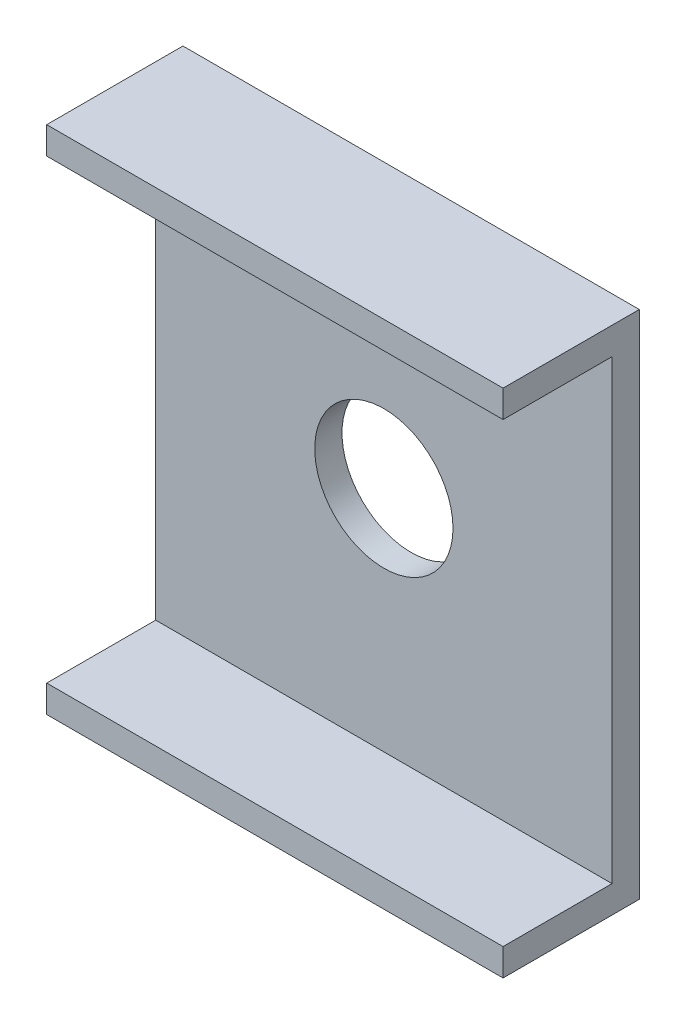
ISO-10303-21;
HEADER;
FILE_DESCRIPTION(('STEP AP214'),'2;1');
FILE_NAME('part.step','',(''),(''),'','','');
FILE_SCHEMA(('AUTOMOTIVE_DESIGN { 1 0 10303 214 1 1 1 1 }'));
ENDSEC;
DATA;
#1=APPLICATION_CONTEXT('core data for automotive mechanical design processes');
#2=APPLICATION_PROTOCOL_DEFINITION('international standard','automotive_design',2000,#1);
#3=PRODUCT_CONTEXT('',#1,'mechanical');
#4=PRODUCT('Part','Part','',(#3));
#5=PRODUCT_RELATED_PRODUCT_CATEGORY('part','',(#4));
#6=PRODUCT_DEFINITION_FORMATION('','',#4);
#7=PRODUCT_DEFINITION_CONTEXT('part definition',#1,'design');
#8=PRODUCT_DEFINITION('design','',#6,#7);
#9=PRODUCT_DEFINITION_SHAPE('','',#8);
#10=(LENGTH_UNIT() NAMED_UNIT(*) SI_UNIT(.MILLI.,.METRE.));
#11=(NAMED_UNIT(*) PLANE_ANGLE_UNIT() SI_UNIT($,.RADIAN.));
#12=(NAMED_UNIT(*) SI_UNIT($,.STERADIAN.) SOLID_ANGLE_UNIT());
#13=UNCERTAINTY_MEASURE_WITH_UNIT(LENGTH_MEASURE(1.E-05),#10,'distance_accuracy_value','');
#14=(GEOMETRIC_REPRESENTATION_CONTEXT(3) GLOBAL_UNCERTAINTY_ASSIGNED_CONTEXT((#13)) GLOBAL_UNIT_ASSIGNED_CONTEXT((#10,
#11,#12)) REPRESENTATION_CONTEXT('',''));
#15=CARTESIAN_POINT('',(0.,0.,0.));
#16=DIRECTION('',(0.,0.,1.));
#17=DIRECTION('',(1.,0.,0.));
#18=AXIS2_PLACEMENT_3D('',#15,#16,#17);
#19=CARTESIAN_POINT('',(17.018,-19.05,10.16));
#20=DIRECTION('',(0.,0.,-1.));
#21=DIRECTION('',(-1.,0.,0.));
#22=AXIS2_PLACEMENT_3D('',#19,#20,#21);
#23=PLANE('',#22);
#24=DIRECTION('',(1.,0.,0.));
#25=VECTOR('',#24,1.);
#26=CARTESIAN_POINT('',(0.,-19.05,10.16));
#27=LINE('',#26,#25);
#28=CARTESIAN_POINT('',(-17.018,-19.05,10.16));
#29=VERTEX_POINT('',#28);
#30=CARTESIAN_POINT('',(17.018,-19.05,10.16));
#31=VERTEX_POINT('',#30);
#32=EDGE_CURVE('E77',#29,#31,#27,.T.);
#33=ORIENTED_EDGE('',*,*,#32,.T.);
#34=DIRECTION('',(0.,1.,0.));
#35=VECTOR('',#34,1.);
#36=CARTESIAN_POINT('',(17.018,0.,10.16));
#37=LINE('',#36,#35);
#38=CARTESIAN_POINT('',(17.018,-17.018000003175,10.16));
#39=VERTEX_POINT('',#38);
#40=EDGE_CURVE('E115',#31,#39,#37,.T.);
#41=ORIENTED_EDGE('',*,*,#40,.T.);
#42=DIRECTION('',(-1.,0.,0.));
#43=VECTOR('',#42,1.);
#44=CARTESIAN_POINT('',(0.,-17.018,10.16));
#45=LINE('',#44,#43);
#46=CARTESIAN_POINT('',(-17.018,-17.018000003175,10.16));
#47=VERTEX_POINT('',#46);
#48=EDGE_CURVE('E131',#39,#47,#45,.T.);
#49=ORIENTED_EDGE('',*,*,#48,.T.);
#50=DIRECTION('',(0.,-1.,0.));
#51=VECTOR('',#50,1.);
#52=CARTESIAN_POINT('',(-17.018,0.,10.16));
#53=LINE('',#52,#51);
#54=EDGE_CURVE('E101',#47,#29,#53,.T.);
#55=ORIENTED_EDGE('',*,*,#54,.T.);
#56=EDGE_LOOP('',(#33,#41,#49,#55));
#57=FACE_BOUND('',#56,.T.);
#58=ADVANCED_FACE('F16',(#57),#23,.F.);
#59=CARTESIAN_POINT('',(-17.018,17.018,10.16));
#60=DIRECTION('',(0.,0.,1.));
#61=DIRECTION('',(1.,0.,0.));
#62=AXIS2_PLACEMENT_3D('',#59,#60,#61);
#63=PLANE('',#62);
#64=DIRECTION('',(0.,1.,0.));
#65=VECTOR('',#64,1.);
#66=CARTESIAN_POINT('',(17.018,0.,10.16));
#67=LINE('',#66,#65);
#68=CARTESIAN_POINT('',(17.018,17.018000003175,10.16));
#69=VERTEX_POINT('',#68);
#70=CARTESIAN_POINT('',(17.018,19.05,10.16));
#71=VERTEX_POINT('',#70);
#72=EDGE_CURVE('E88',#69,#71,#67,.T.);
#73=ORIENTED_EDGE('',*,*,#72,.T.);
#74=DIRECTION('',(-1.,0.,0.));
#75=VECTOR('',#74,1.);
#76=CARTESIAN_POINT('',(0.,19.05,10.16));
#77=LINE('',#76,#75);
#78=CARTESIAN_POINT('',(-17.018,19.05,10.16));
#79=VERTEX_POINT('',#78);
#80=EDGE_CURVE('E82',#71,#79,#77,.T.);
#81=ORIENTED_EDGE('',*,*,#80,.T.);
#82=DIRECTION('',(0.,-1.,0.));
#83=VECTOR('',#82,1.);
#84=CARTESIAN_POINT('',(-17.018,0.,10.16));
#85=LINE('',#84,#83);
#86=CARTESIAN_POINT('',(-17.018,17.01800000635,10.16));
#87=VERTEX_POINT('',#86);
#88=EDGE_CURVE('E86',#79,#87,#85,.T.);
#89=ORIENTED_EDGE('',*,*,#88,.T.);
#90=DIRECTION('',(1.,0.,0.));
#91=VECTOR('',#90,1.);
#92=CARTESIAN_POINT('',(0.,17.018,10.16));
#93=LINE('',#92,#91);
#94=EDGE_CURVE('E151',#87,#69,#93,.T.);
#95=ORIENTED_EDGE('',*,*,#94,.T.);
#96=EDGE_LOOP('',(#73,#81,#89,#95));
#97=FACE_BOUND('',#96,.T.);
#98=ADVANCED_FACE('F84',(#97),#63,.T.);
#99=CARTESIAN_POINT('',(-17.018,-19.05,0.));
#100=DIRECTION('',(0.,1.,0.));
#101=DIRECTION('',(0.,0.,1.));
#102=AXIS2_PLACEMENT_3D('',#99,#100,#101);
#103=PLANE('',#102);
#104=DIRECTION('',(0.,0.,1.));
#105=VECTOR('',#104,1.);
#106=CARTESIAN_POINT('',(17.018,-19.05,5.08));
#107=LINE('',#106,#105);
#108=CARTESIAN_POINT('',(17.018,-19.05,0.));
#109=VERTEX_POINT('',#108);
#110=EDGE_CURVE('E120',#109,#31,#107,.T.);
#111=ORIENTED_EDGE('',*,*,#110,.T.);
#112=ORIENTED_EDGE('',*,*,#32,.F.);
#113=DIRECTION('',(0.,0.,-1.));
#114=VECTOR('',#113,1.);
#115=CARTESIAN_POINT('',(-17.018,-19.05,5.08));
#116=LINE('',#115,#114);
#117=CARTESIAN_POINT('',(-17.018,-19.05,0.));
#118=VERTEX_POINT('',#117);
#119=EDGE_CURVE('E136',#29,#118,#116,.T.);
#120=ORIENTED_EDGE('',*,*,#119,.T.);
#121=DIRECTION('',(1.,0.,0.));
#122=VECTOR('',#121,1.);
#123=CARTESIAN_POINT('',(0.,-19.05,0.));
#124=LINE('',#123,#122);
#125=EDGE_CURVE('E127',#118,#109,#124,.T.);
#126=ORIENTED_EDGE('',*,*,#125,.T.);
#127=EDGE_LOOP('',(#111,#112,#120,#126));
#128=FACE_BOUND('',#127,.T.);
#129=ADVANCED_FACE('F126',(#128),#103,.F.);
#130=CARTESIAN_POINT('',(-17.018,19.05,0.));
#131=DIRECTION('',(0.,-1.,0.));
#132=DIRECTION('',(1.,0.,0.));
#133=AXIS2_PLACEMENT_3D('',#130,#131,#132);
#134=PLANE('',#133);
#135=DIRECTION('',(0.,0.,1.));
#136=VECTOR('',#135,1.);
#137=CARTESIAN_POINT('',(-17.018,19.05,5.08));
#138=LINE('',#137,#136);
#139=CARTESIAN_POINT('',(-17.018,19.05,0.));
#140=VERTEX_POINT('',#139);
#141=EDGE_CURVE('E92',#140,#79,#138,.T.);
#142=ORIENTED_EDGE('',*,*,#141,.T.);
#143=ORIENTED_EDGE('',*,*,#80,.F.);
#144=DIRECTION('',(0.,0.,-1.));
#145=VECTOR('',#144,1.);
#146=CARTESIAN_POINT('',(17.018,19.05,5.08));
#147=LINE('',#146,#145);
#148=CARTESIAN_POINT('',(17.018,19.05,0.));
#149=VERTEX_POINT('',#148);
#150=EDGE_CURVE('E154',#71,#149,#147,.T.);
#151=ORIENTED_EDGE('',*,*,#150,.T.);
#152=DIRECTION('',(-1.,0.,0.));
#153=VECTOR('',#152,1.);
#154=CARTESIAN_POINT('',(0.,19.05,0.));
#155=LINE('',#154,#153);
#156=EDGE_CURVE('E106',#149,#140,#155,.T.);
#157=ORIENTED_EDGE('',*,*,#156,.T.);
#158=EDGE_LOOP('',(#142,#143,#151,#157));
#159=FACE_BOUND('',#158,.T.);
#160=ADVANCED_FACE('F104',(#159),#134,.F.);
#161=CARTESIAN_POINT('',(-17.018,-19.05,0.));
#162=DIRECTION('',(1.,0.,0.));
#163=DIRECTION('',(0.,1.,0.));
#164=AXIS2_PLACEMENT_3D('',#161,#162,#163);
#165=PLANE('',#164);
#166=ORIENTED_EDGE('',*,*,#119,.F.);
#167=ORIENTED_EDGE('',*,*,#54,.F.);
#168=DIRECTION('',(0.,0.,-1.));
#169=VECTOR('',#168,1.);
#170=CARTESIAN_POINT('',(-17.018,-17.018,6.096));
#171=LINE('',#170,#169);
#172=CARTESIAN_POINT('',(-17.018,-17.01800000635,2.032));
#173=VERTEX_POINT('',#172);
#174=EDGE_CURVE('E128',#47,#173,#171,.T.);
#175=ORIENTED_EDGE('',*,*,#174,.T.);
#176=DIRECTION('',(0.,-1.,0.));
#177=VECTOR('',#176,1.);
#178=CARTESIAN_POINT('',(-17.018,0.,2.032));
#179=LINE('',#178,#177);
#180=CARTESIAN_POINT('',(-17.018,17.01800000635,2.032));
#181=VERTEX_POINT('',#180);
#182=EDGE_CURVE('E139',#181,#173,#179,.T.);
#183=ORIENTED_EDGE('',*,*,#182,.F.);
#184=DIRECTION('',(0.,0.,1.));
#185=VECTOR('',#184,1.);
#186=CARTESIAN_POINT('',(-17.018,17.018,6.096));
#187=LINE('',#186,#185);
#188=EDGE_CURVE('E100',#181,#87,#187,.T.);
#189=ORIENTED_EDGE('',*,*,#188,.T.);
#190=ORIENTED_EDGE('',*,*,#88,.F.);
#191=ORIENTED_EDGE('',*,*,#141,.F.);
#192=DIRECTION('',(0.,-1.,0.));
#193=VECTOR('',#192,1.);
#194=CARTESIAN_POINT('',(-17.018,0.,0.));
#195=LINE('',#194,#193);
#196=EDGE_CURVE('E137',#140,#118,#195,.T.);
#197=ORIENTED_EDGE('',*,*,#196,.T.);
#198=EDGE_LOOP('',(#166,#167,#175,#183,#189,#190,#191,#197));
#199=FACE_BOUND('',#198,.T.);
#200=ADVANCED_FACE('F96',(#199),#165,.F.);
#201=CARTESIAN_POINT('',(-17.018,-17.018,10.16));
#202=DIRECTION('',(0.,-1.,0.));
#203=DIRECTION('',(0.,0.,-1.));
#204=AXIS2_PLACEMENT_3D('',#201,#202,#203);
#205=PLANE('',#204);
#206=ORIENTED_EDGE('',*,*,#174,.F.);
#207=ORIENTED_EDGE('',*,*,#48,.F.);
#208=DIRECTION('',(0.,0.,-1.));
#209=VECTOR('',#208,1.);
#210=CARTESIAN_POINT('',(17.018,-17.0180000127,5.08));
#211=LINE('',#210,#209);
#212=CARTESIAN_POINT('',(17.018,-17.018000003175,2.032));
#213=VERTEX_POINT('',#212);
#214=EDGE_CURVE('E123',#39,#213,#211,.T.);
#215=ORIENTED_EDGE('',*,*,#214,.T.);
#216=DIRECTION('',(1.,0.,0.));
#217=VECTOR('',#216,1.);
#218=CARTESIAN_POINT('',(0.,-17.018,2.032));
#219=LINE('',#218,#217);
#220=EDGE_CURVE('E141',#173,#213,#219,.T.);
#221=ORIENTED_EDGE('',*,*,#220,.F.);
#222=EDGE_LOOP('',(#206,#207,#215,#221));
#223=FACE_BOUND('',#222,.T.);
#224=ADVANCED_FACE('F159',(#223),#205,.F.);
#225=CARTESIAN_POINT('',(17.018,-19.05,0.));
#226=DIRECTION('',(-1.,0.,0.));
#227=DIRECTION('',(0.,0.,1.));
#228=AXIS2_PLACEMENT_3D('',#225,#226,#227);
#229=PLANE('',#228);
#230=ORIENTED_EDGE('',*,*,#150,.F.);
#231=ORIENTED_EDGE('',*,*,#72,.F.);
#232=DIRECTION('',(0.,0.,-1.));
#233=VECTOR('',#232,1.);
#234=CARTESIAN_POINT('',(17.018,17.018,6.096));
#235=LINE('',#234,#233);
#236=CARTESIAN_POINT('',(17.018,17.01800000635,2.032));
#237=VERTEX_POINT('',#236);
#238=EDGE_CURVE('E149',#69,#237,#235,.T.);
#239=ORIENTED_EDGE('',*,*,#238,.T.);
#240=DIRECTION('',(0.,1.,0.));
#241=VECTOR('',#240,1.);
#242=CARTESIAN_POINT('',(17.018,0.,2.032));
#243=LINE('',#242,#241);
#244=EDGE_CURVE('E33',#213,#237,#243,.T.);
#245=ORIENTED_EDGE('',*,*,#244,.F.);
#246=ORIENTED_EDGE('',*,*,#214,.F.);
#247=ORIENTED_EDGE('',*,*,#40,.F.);
#248=ORIENTED_EDGE('',*,*,#110,.F.);
#249=DIRECTION('',(0.,1.,0.));
#250=VECTOR('',#249,1.);
#251=CARTESIAN_POINT('',(17.018,0.,0.));
#252=LINE('',#251,#250);
#253=EDGE_CURVE('E143',#109,#149,#252,.T.);
#254=ORIENTED_EDGE('',*,*,#253,.T.);
#255=EDGE_LOOP('',(#230,#231,#239,#245,#246,#247,#248,#254));
#256=FACE_BOUND('',#255,.T.);
#257=ADVANCED_FACE('F118',(#256),#229,.F.);
#258=CARTESIAN_POINT('',(-17.018,17.018,2.032));
#259=DIRECTION('',(0.,1.,0.));
#260=DIRECTION('',(0.,0.,1.));
#261=AXIS2_PLACEMENT_3D('',#258,#259,#260);
#262=PLANE('',#261);
#263=ORIENTED_EDGE('',*,*,#238,.F.);
#264=ORIENTED_EDGE('',*,*,#94,.F.);
#265=ORIENTED_EDGE('',*,*,#188,.F.);
#266=DIRECTION('',(-1.,0.,0.));
#267=VECTOR('',#266,1.);
#268=CARTESIAN_POINT('',(0.,17.018,2.032));
#269=LINE('',#268,#267);
#270=EDGE_CURVE('E162',#237,#181,#269,.T.);
#271=ORIENTED_EDGE('',*,*,#270,.F.);
#272=EDGE_LOOP('',(#263,#264,#265,#271));
#273=FACE_BOUND('',#272,.T.);
#274=ADVANCED_FACE('F166',(#273),#262,.F.);
#275=CARTESIAN_POINT('',(-17.018,-19.05,0.));
#276=DIRECTION('',(0.,0.,1.));
#277=DIRECTION('',(1.,0.,0.));
#278=AXIS2_PLACEMENT_3D('',#275,#276,#277);
#279=PLANE('',#278);
#280=CARTESIAN_POINT('',(0.,0.,0.));
#281=DIRECTION('',(0.,0.,1.));
#282=DIRECTION('',(1.,0.,0.));
#283=AXIS2_PLACEMENT_3D('',#280,#281,#282);
#284=CIRCLE('',#283,5.1562);
#285=CARTESIAN_POINT('',(5.1562,0.,0.));
#286=VERTEX_POINT('',#285);
#287=EDGE_CURVE('E20',#286,#286,#284,.F.);
#288=ORIENTED_EDGE('',*,*,#287,.F.);
#289=EDGE_LOOP('',(#288));
#290=FACE_BOUND('',#289,.T.);
#291=ORIENTED_EDGE('',*,*,#156,.F.);
#292=ORIENTED_EDGE('',*,*,#253,.F.);
#293=ORIENTED_EDGE('',*,*,#125,.F.);
#294=ORIENTED_EDGE('',*,*,#196,.F.);
#295=EDGE_LOOP('',(#291,#292,#293,#294));
#296=FACE_BOUND('',#295,.T.);
#297=ADVANCED_FACE('F168',(#290,#296),#279,.F.);
#298=CARTESIAN_POINT('',(-17.018,-17.018,2.032));
#299=DIRECTION('',(0.,0.,1.));
#300=DIRECTION('',(1.,0.,0.));
#301=AXIS2_PLACEMENT_3D('',#298,#299,#300);
#302=PLANE('',#301);
#303=CARTESIAN_POINT('',(0.,0.,2.032));
#304=DIRECTION('',(0.,0.,1.));
#305=DIRECTION('',(1.,0.,0.));
#306=AXIS2_PLACEMENT_3D('',#303,#304,#305);
#307=CIRCLE('',#306,5.1562);
#308=CARTESIAN_POINT('',(5.1562,0.,2.032));
#309=VERTEX_POINT('',#308);
#310=EDGE_CURVE('E11',#309,#309,#307,.T.);
#311=ORIENTED_EDGE('',*,*,#310,.F.);
#312=EDGE_LOOP('',(#311));
#313=FACE_BOUND('',#312,.T.);
#314=ORIENTED_EDGE('',*,*,#244,.T.);
#315=ORIENTED_EDGE('',*,*,#270,.T.);
#316=ORIENTED_EDGE('',*,*,#182,.T.);
#317=ORIENTED_EDGE('',*,*,#220,.T.);
#318=EDGE_LOOP('',(#314,#315,#316,#317));
#319=FACE_BOUND('',#318,.T.);
#320=ADVANCED_FACE('F18',(#313,#319),#302,.T.);
#321=CARTESIAN_POINT('',(0.,0.,0.));
#322=DIRECTION('',(0.,0.,1.));
#323=DIRECTION('',(1.,0.,0.));
#324=AXIS2_PLACEMENT_3D('',#321,#322,#323);
#325=CYLINDRICAL_SURFACE('',#324,5.1562);
#326=ORIENTED_EDGE('',*,*,#310,.T.);
#327=EDGE_LOOP('',(#326));
#328=FACE_BOUND('',#327,.T.);
#329=ORIENTED_EDGE('',*,*,#287,.T.);
#330=EDGE_LOOP('',(#329));
#331=FACE_BOUND('',#330,.T.);
#332=ADVANCED_FACE('F177',(#328,#331),#325,.F.);
#333=CLOSED_SHELL('',(#58,#98,#129,#160,#200,#224,#257,#274,#297,#320,#332));
#334=MANIFOLD_SOLID_BREP('B1',#333);
#335=ADVANCED_BREP_SHAPE_REPRESENTATION('',(#18,#334),#14);
#336=SHAPE_DEFINITION_REPRESENTATION(#9,#335);
ENDSEC;
END-ISO-10303-21;
